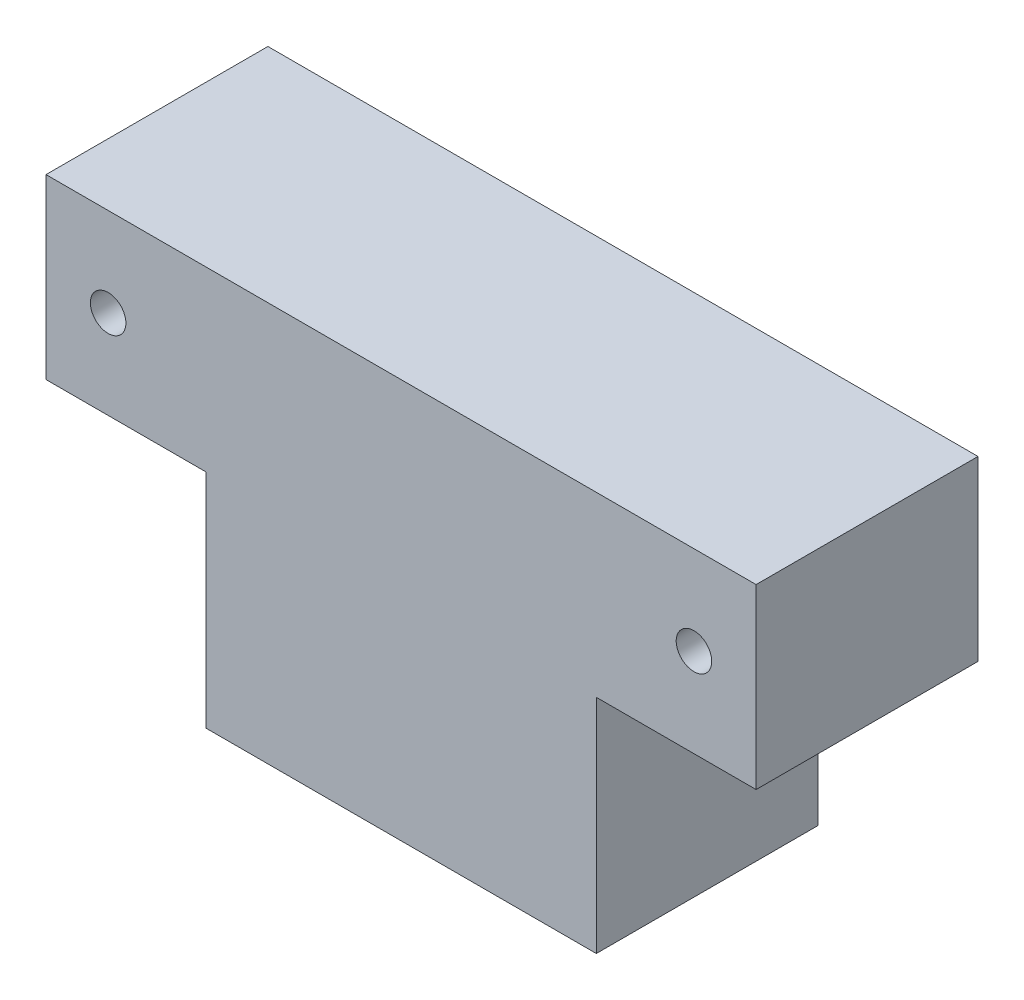
ISO-10303-21;
HEADER;
FILE_DESCRIPTION(('STEP AP214'),'2;1');
FILE_NAME('part.step','',(''),(''),'','','');
FILE_SCHEMA(('AUTOMOTIVE_DESIGN { 1 0 10303 214 1 1 1 1 }'));
ENDSEC;
DATA;
#1=APPLICATION_CONTEXT('core data for automotive mechanical design processes');
#2=APPLICATION_PROTOCOL_DEFINITION('international standard','automotive_design',2000,#1);
#3=PRODUCT_CONTEXT('',#1,'mechanical');
#4=PRODUCT('Part','Part','',(#3));
#5=PRODUCT_RELATED_PRODUCT_CATEGORY('part','',(#4));
#6=PRODUCT_DEFINITION_FORMATION('','',#4);
#7=PRODUCT_DEFINITION_CONTEXT('part definition',#1,'design');
#8=PRODUCT_DEFINITION('design','',#6,#7);
#9=PRODUCT_DEFINITION_SHAPE('','',#8);
#10=(LENGTH_UNIT() NAMED_UNIT(*) SI_UNIT(.MILLI.,.METRE.));
#11=(NAMED_UNIT(*) PLANE_ANGLE_UNIT() SI_UNIT($,.RADIAN.));
#12=(NAMED_UNIT(*) SI_UNIT($,.STERADIAN.) SOLID_ANGLE_UNIT());
#13=UNCERTAINTY_MEASURE_WITH_UNIT(LENGTH_MEASURE(1.E-05),#10,'distance_accuracy_value','');
#14=(GEOMETRIC_REPRESENTATION_CONTEXT(3) GLOBAL_UNCERTAINTY_ASSIGNED_CONTEXT((#13)) GLOBAL_UNIT_ASSIGNED_CONTEXT((#10,
#11,#12)) REPRESENTATION_CONTEXT('',''));
#15=CARTESIAN_POINT('',(0.,0.,0.));
#16=DIRECTION('',(0.,0.,1.));
#17=DIRECTION('',(1.,0.,0.));
#18=AXIS2_PLACEMENT_3D('',#15,#16,#17);
#19=CARTESIAN_POINT('',(0.,0.,25.));
#20=DIRECTION('',(0.,0.,1.));
#21=DIRECTION('',(1.,0.,0.));
#22=AXIS2_PLACEMENT_3D('',#19,#20,#21);
#23=PLANE('',#22);
#24=CARTESIAN_POINT('',(33.,0.,25.));
#25=DIRECTION('',(0.,0.,1.));
#26=DIRECTION('',(1.,0.,0.));
#27=AXIS2_PLACEMENT_3D('',#24,#25,#26);
#28=CIRCLE('',#27,2.);
#29=CARTESIAN_POINT('',(35.,0.,25.));
#30=VERTEX_POINT('',#29);
#31=EDGE_CURVE('E134',#30,#30,#28,.T.);
#32=ORIENTED_EDGE('',*,*,#31,.F.);
#33=EDGE_LOOP('',(#32));
#34=FACE_BOUND('',#33,.T.);
#35=DIRECTION('',(0.,-1.,0.));
#36=VECTOR('',#35,1.);
#37=CARTESIAN_POINT('',(-40.,-10.,25.));
#38=LINE('',#37,#36);
#39=CARTESIAN_POINT('',(-40.,9.99999999999999,25.));
#40=VERTEX_POINT('',#39);
#41=CARTESIAN_POINT('',(-40.,-10.,25.));
#42=VERTEX_POINT('',#41);
#43=EDGE_CURVE('E145',#40,#42,#38,.T.);
#44=ORIENTED_EDGE('',*,*,#43,.T.);
#45=DIRECTION('',(1.,0.,0.));
#46=VECTOR('',#45,1.);
#47=CARTESIAN_POINT('',(-22.,-10.,25.));
#48=LINE('',#47,#46);
#49=CARTESIAN_POINT('',(-22.,-10.,25.));
#50=VERTEX_POINT('',#49);
#51=EDGE_CURVE('E93',#42,#50,#48,.T.);
#52=ORIENTED_EDGE('',*,*,#51,.T.);
#53=DIRECTION('',(0.,-1.,0.));
#54=VECTOR('',#53,1.);
#55=CARTESIAN_POINT('',(-22.,-10.,25.));
#56=LINE('',#55,#54);
#57=CARTESIAN_POINT('',(-22.,-35.,25.));
#58=VERTEX_POINT('',#57);
#59=EDGE_CURVE('E160',#50,#58,#56,.T.);
#60=ORIENTED_EDGE('',*,*,#59,.T.);
#61=DIRECTION('',(1.,0.,0.));
#62=VECTOR('',#61,1.);
#63=CARTESIAN_POINT('',(-22.,-35.,25.));
#64=LINE('',#63,#62);
#65=CARTESIAN_POINT('',(22.,-35.,25.));
#66=VERTEX_POINT('',#65);
#67=EDGE_CURVE('E173',#58,#66,#64,.T.);
#68=ORIENTED_EDGE('',*,*,#67,.T.);
#69=DIRECTION('',(0.,1.,0.));
#70=VECTOR('',#69,1.);
#71=CARTESIAN_POINT('',(22.,-10.,25.));
#72=LINE('',#71,#70);
#73=CARTESIAN_POINT('',(22.,-10.,25.));
#74=VERTEX_POINT('',#73);
#75=EDGE_CURVE('E112',#66,#74,#72,.T.);
#76=ORIENTED_EDGE('',*,*,#75,.T.);
#77=DIRECTION('',(1.,0.,0.));
#78=VECTOR('',#77,1.);
#79=CARTESIAN_POINT('',(40.,-9.99999999999999,25.));
#80=LINE('',#79,#78);
#81=CARTESIAN_POINT('',(40.,-9.99999999999999,25.));
#82=VERTEX_POINT('',#81);
#83=EDGE_CURVE('E106',#74,#82,#80,.T.);
#84=ORIENTED_EDGE('',*,*,#83,.T.);
#85=DIRECTION('',(0.,1.,0.));
#86=VECTOR('',#85,1.);
#87=CARTESIAN_POINT('',(40.,-9.99999999999999,25.));
#88=LINE('',#87,#86);
#89=CARTESIAN_POINT('',(40.,10.,25.));
#90=VERTEX_POINT('',#89);
#91=EDGE_CURVE('E110',#82,#90,#88,.T.);
#92=ORIENTED_EDGE('',*,*,#91,.T.);
#93=DIRECTION('',(-1.,0.,0.));
#94=VECTOR('',#93,1.);
#95=CARTESIAN_POINT('',(40.,10.,25.));
#96=LINE('',#95,#94);
#97=EDGE_CURVE('E50',#90,#40,#96,.T.);
#98=ORIENTED_EDGE('',*,*,#97,.T.);
#99=EDGE_LOOP('',(#44,#52,#60,#68,#76,#84,#92,#98));
#100=FACE_BOUND('',#99,.T.);
#101=CARTESIAN_POINT('',(-33.,0.,25.));
#102=DIRECTION('',(0.,0.,1.));
#103=DIRECTION('',(1.,0.,0.));
#104=AXIS2_PLACEMENT_3D('',#101,#102,#103);
#105=CIRCLE('',#104,2.);
#106=CARTESIAN_POINT('',(-31.,0.,25.));
#107=VERTEX_POINT('',#106);
#108=EDGE_CURVE('E182',#107,#107,#105,.T.);
#109=ORIENTED_EDGE('',*,*,#108,.F.);
#110=EDGE_LOOP('',(#109));
#111=FACE_BOUND('',#110,.T.);
#112=ADVANCED_FACE('F33',(#34,#100,#111),#23,.T.);
#113=CARTESIAN_POINT('',(0.,0.,0.));
#114=DIRECTION('',(0.,0.,1.));
#115=DIRECTION('',(1.,0.,0.));
#116=AXIS2_PLACEMENT_3D('',#113,#114,#115);
#117=PLANE('',#116);
#118=DIRECTION('',(0.,-1.,0.));
#119=VECTOR('',#118,1.);
#120=CARTESIAN_POINT('',(-40.,-10.,0.));
#121=LINE('',#120,#119);
#122=CARTESIAN_POINT('',(-40.,9.99999999999999,0.));
#123=VERTEX_POINT('',#122);
#124=CARTESIAN_POINT('',(-40.,-10.,0.));
#125=VERTEX_POINT('',#124);
#126=EDGE_CURVE('E130',#123,#125,#121,.T.);
#127=ORIENTED_EDGE('',*,*,#126,.F.);
#128=DIRECTION('',(-1.,0.,0.));
#129=VECTOR('',#128,1.);
#130=CARTESIAN_POINT('',(40.,10.,0.));
#131=LINE('',#130,#129);
#132=CARTESIAN_POINT('',(40.,10.,0.));
#133=VERTEX_POINT('',#132);
#134=EDGE_CURVE('E85',#133,#123,#131,.T.);
#135=ORIENTED_EDGE('',*,*,#134,.F.);
#136=DIRECTION('',(0.,1.,0.));
#137=VECTOR('',#136,1.);
#138=CARTESIAN_POINT('',(40.,-9.99999999999999,0.));
#139=LINE('',#138,#137);
#140=CARTESIAN_POINT('',(40.,-9.99999999999999,0.));
#141=VERTEX_POINT('',#140);
#142=EDGE_CURVE('E79',#141,#133,#139,.T.);
#143=ORIENTED_EDGE('',*,*,#142,.F.);
#144=DIRECTION('',(1.,0.,0.));
#145=VECTOR('',#144,1.);
#146=CARTESIAN_POINT('',(40.,-9.99999999999999,0.));
#147=LINE('',#146,#145);
#148=CARTESIAN_POINT('',(22.,-10.,0.));
#149=VERTEX_POINT('',#148);
#150=EDGE_CURVE('E120',#149,#141,#147,.T.);
#151=ORIENTED_EDGE('',*,*,#150,.F.);
#152=DIRECTION('',(0.,1.,0.));
#153=VECTOR('',#152,1.);
#154=CARTESIAN_POINT('',(22.,-10.,0.));
#155=LINE('',#154,#153);
#156=CARTESIAN_POINT('',(22.,-35.,0.));
#157=VERTEX_POINT('',#156);
#158=EDGE_CURVE('E140',#157,#149,#155,.T.);
#159=ORIENTED_EDGE('',*,*,#158,.F.);
#160=DIRECTION('',(1.,0.,0.));
#161=VECTOR('',#160,1.);
#162=CARTESIAN_POINT('',(-22.,-35.,0.));
#163=LINE('',#162,#161);
#164=CARTESIAN_POINT('',(-22.,-35.,0.));
#165=VERTEX_POINT('',#164);
#166=EDGE_CURVE('E138',#165,#157,#163,.T.);
#167=ORIENTED_EDGE('',*,*,#166,.F.);
#168=DIRECTION('',(0.,-1.,0.));
#169=VECTOR('',#168,1.);
#170=CARTESIAN_POINT('',(-22.,-10.,0.));
#171=LINE('',#170,#169);
#172=CARTESIAN_POINT('',(-22.,-10.,0.));
#173=VERTEX_POINT('',#172);
#174=EDGE_CURVE('E136',#173,#165,#171,.T.);
#175=ORIENTED_EDGE('',*,*,#174,.F.);
#176=DIRECTION('',(1.,0.,0.));
#177=VECTOR('',#176,1.);
#178=CARTESIAN_POINT('',(-22.,-10.,0.));
#179=LINE('',#178,#177);
#180=EDGE_CURVE('E133',#125,#173,#179,.T.);
#181=ORIENTED_EDGE('',*,*,#180,.F.);
#182=EDGE_LOOP('',(#127,#135,#143,#151,#159,#167,#175,#181));
#183=FACE_BOUND('',#182,.T.);
#184=CARTESIAN_POINT('',(33.,0.,0.));
#185=DIRECTION('',(0.,0.,1.));
#186=DIRECTION('',(1.,0.,0.));
#187=AXIS2_PLACEMENT_3D('',#184,#185,#186);
#188=CIRCLE('',#187,2.);
#189=CARTESIAN_POINT('',(35.,0.,0.));
#190=VERTEX_POINT('',#189);
#191=EDGE_CURVE('E179',#190,#190,#188,.T.);
#192=ORIENTED_EDGE('',*,*,#191,.T.);
#193=EDGE_LOOP('',(#192));
#194=FACE_BOUND('',#193,.T.);
#195=CARTESIAN_POINT('',(-33.,0.,0.));
#196=DIRECTION('',(0.,0.,1.));
#197=DIRECTION('',(1.,0.,0.));
#198=AXIS2_PLACEMENT_3D('',#195,#196,#197);
#199=CIRCLE('',#198,2.);
#200=CARTESIAN_POINT('',(-31.,0.,0.));
#201=VERTEX_POINT('',#200);
#202=EDGE_CURVE('E185',#201,#201,#199,.T.);
#203=ORIENTED_EDGE('',*,*,#202,.T.);
#204=EDGE_LOOP('',(#203));
#205=FACE_BOUND('',#204,.T.);
#206=ADVANCED_FACE('F164',(#183,#194,#205),#117,.F.);
#207=CARTESIAN_POINT('',(-40.,-10.,25.));
#208=DIRECTION('',(1.,0.,0.));
#209=DIRECTION('',(0.,0.,-1.));
#210=AXIS2_PLACEMENT_3D('',#207,#208,#209);
#211=PLANE('',#210);
#212=ORIENTED_EDGE('',*,*,#126,.T.);
#213=DIRECTION('',(0.,0.,-1.));
#214=VECTOR('',#213,1.);
#215=CARTESIAN_POINT('',(-40.,-10.,25.));
#216=LINE('',#215,#214);
#217=EDGE_CURVE('E11',#42,#125,#216,.T.);
#218=ORIENTED_EDGE('',*,*,#217,.F.);
#219=ORIENTED_EDGE('',*,*,#43,.F.);
#220=DIRECTION('',(0.,0.,-1.));
#221=VECTOR('',#220,1.);
#222=CARTESIAN_POINT('',(-40.,9.99999999999999,25.));
#223=LINE('',#222,#221);
#224=EDGE_CURVE('E126',#40,#123,#223,.T.);
#225=ORIENTED_EDGE('',*,*,#224,.T.);
#226=EDGE_LOOP('',(#212,#218,#219,#225));
#227=FACE_BOUND('',#226,.T.);
#228=ADVANCED_FACE('F35',(#227),#211,.F.);
#229=CARTESIAN_POINT('',(-22.,-10.,25.));
#230=DIRECTION('',(0.,1.,0.));
#231=DIRECTION('',(-1.,0.,0.));
#232=AXIS2_PLACEMENT_3D('',#229,#230,#231);
#233=PLANE('',#232);
#234=ORIENTED_EDGE('',*,*,#180,.T.);
#235=DIRECTION('',(0.,0.,-1.));
#236=VECTOR('',#235,1.);
#237=CARTESIAN_POINT('',(-22.,-10.,25.));
#238=LINE('',#237,#236);
#239=EDGE_CURVE('E42',#50,#173,#238,.T.);
#240=ORIENTED_EDGE('',*,*,#239,.F.);
#241=ORIENTED_EDGE('',*,*,#51,.F.);
#242=ORIENTED_EDGE('',*,*,#217,.T.);
#243=EDGE_LOOP('',(#234,#240,#241,#242));
#244=FACE_BOUND('',#243,.T.);
#245=ADVANCED_FACE('F217',(#244),#233,.F.);
#246=CARTESIAN_POINT('',(-22.,-10.,25.));
#247=DIRECTION('',(1.,0.,0.));
#248=DIRECTION('',(0.,1.,0.));
#249=AXIS2_PLACEMENT_3D('',#246,#247,#248);
#250=PLANE('',#249);
#251=ORIENTED_EDGE('',*,*,#174,.T.);
#252=DIRECTION('',(0.,0.,-1.));
#253=VECTOR('',#252,1.);
#254=CARTESIAN_POINT('',(-22.,-35.,25.));
#255=LINE('',#254,#253);
#256=EDGE_CURVE('E152',#58,#165,#255,.T.);
#257=ORIENTED_EDGE('',*,*,#256,.F.);
#258=ORIENTED_EDGE('',*,*,#59,.F.);
#259=ORIENTED_EDGE('',*,*,#239,.T.);
#260=EDGE_LOOP('',(#251,#257,#258,#259));
#261=FACE_BOUND('',#260,.T.);
#262=ADVANCED_FACE('F158',(#261),#250,.F.);
#263=CARTESIAN_POINT('',(-22.,-35.,25.));
#264=DIRECTION('',(0.,1.,0.));
#265=DIRECTION('',(0.,0.,1.));
#266=AXIS2_PLACEMENT_3D('',#263,#264,#265);
#267=PLANE('',#266);
#268=ORIENTED_EDGE('',*,*,#166,.T.);
#269=DIRECTION('',(0.,0.,-1.));
#270=VECTOR('',#269,1.);
#271=CARTESIAN_POINT('',(22.,-35.,25.));
#272=LINE('',#271,#270);
#273=EDGE_CURVE('E149',#66,#157,#272,.T.);
#274=ORIENTED_EDGE('',*,*,#273,.F.);
#275=ORIENTED_EDGE('',*,*,#67,.F.);
#276=ORIENTED_EDGE('',*,*,#256,.T.);
#277=EDGE_LOOP('',(#268,#274,#275,#276));
#278=FACE_BOUND('',#277,.T.);
#279=ADVANCED_FACE('F169',(#278),#267,.F.);
#280=CARTESIAN_POINT('',(22.,-10.,25.));
#281=DIRECTION('',(-1.,0.,0.));
#282=DIRECTION('',(0.,-1.,0.));
#283=AXIS2_PLACEMENT_3D('',#280,#281,#282);
#284=PLANE('',#283);
#285=ORIENTED_EDGE('',*,*,#158,.T.);
#286=DIRECTION('',(0.,0.,-1.));
#287=VECTOR('',#286,1.);
#288=CARTESIAN_POINT('',(22.,-10.,25.));
#289=LINE('',#288,#287);
#290=EDGE_CURVE('E121',#74,#149,#289,.T.);
#291=ORIENTED_EDGE('',*,*,#290,.F.);
#292=ORIENTED_EDGE('',*,*,#75,.F.);
#293=ORIENTED_EDGE('',*,*,#273,.T.);
#294=EDGE_LOOP('',(#285,#291,#292,#293));
#295=FACE_BOUND('',#294,.T.);
#296=ADVANCED_FACE('F172',(#295),#284,.F.);
#297=CARTESIAN_POINT('',(40.,-9.99999999999999,25.));
#298=DIRECTION('',(0.,1.,0.));
#299=DIRECTION('',(-1.,0.,0.));
#300=AXIS2_PLACEMENT_3D('',#297,#298,#299);
#301=PLANE('',#300);
#302=ORIENTED_EDGE('',*,*,#150,.T.);
#303=DIRECTION('',(0.,0.,-1.));
#304=VECTOR('',#303,1.);
#305=CARTESIAN_POINT('',(40.,-9.99999999999999,25.));
#306=LINE('',#305,#304);
#307=EDGE_CURVE('E117',#82,#141,#306,.T.);
#308=ORIENTED_EDGE('',*,*,#307,.F.);
#309=ORIENTED_EDGE('',*,*,#83,.F.);
#310=ORIENTED_EDGE('',*,*,#290,.T.);
#311=EDGE_LOOP('',(#302,#308,#309,#310));
#312=FACE_BOUND('',#311,.T.);
#313=ADVANCED_FACE('F118',(#312),#301,.F.);
#314=CARTESIAN_POINT('',(40.,-9.99999999999999,25.));
#315=DIRECTION('',(-1.,0.,0.));
#316=DIRECTION('',(0.,0.,1.));
#317=AXIS2_PLACEMENT_3D('',#314,#315,#316);
#318=PLANE('',#317);
#319=ORIENTED_EDGE('',*,*,#142,.T.);
#320=DIRECTION('',(0.,0.,-1.));
#321=VECTOR('',#320,1.);
#322=CARTESIAN_POINT('',(40.,10.,25.));
#323=LINE('',#322,#321);
#324=EDGE_CURVE('E122',#90,#133,#323,.T.);
#325=ORIENTED_EDGE('',*,*,#324,.F.);
#326=ORIENTED_EDGE('',*,*,#91,.F.);
#327=ORIENTED_EDGE('',*,*,#307,.T.);
#328=EDGE_LOOP('',(#319,#325,#326,#327));
#329=FACE_BOUND('',#328,.T.);
#330=ADVANCED_FACE('F124',(#329),#318,.F.);
#331=CARTESIAN_POINT('',(40.,10.,25.));
#332=DIRECTION('',(0.,-1.,0.));
#333=DIRECTION('',(1.,0.,0.));
#334=AXIS2_PLACEMENT_3D('',#331,#332,#333);
#335=PLANE('',#334);
#336=ORIENTED_EDGE('',*,*,#134,.T.);
#337=ORIENTED_EDGE('',*,*,#224,.F.);
#338=ORIENTED_EDGE('',*,*,#97,.F.);
#339=ORIENTED_EDGE('',*,*,#324,.T.);
#340=EDGE_LOOP('',(#336,#337,#338,#339));
#341=FACE_BOUND('',#340,.T.);
#342=ADVANCED_FACE('F205',(#341),#335,.F.);
#343=CARTESIAN_POINT('',(33.,0.,25.));
#344=DIRECTION('',(0.,0.,-1.));
#345=DIRECTION('',(-1.,0.,0.));
#346=AXIS2_PLACEMENT_3D('',#343,#344,#345);
#347=CYLINDRICAL_SURFACE('',#346,2.);
#348=ORIENTED_EDGE('',*,*,#31,.T.);
#349=EDGE_LOOP('',(#348));
#350=FACE_BOUND('',#349,.T.);
#351=ORIENTED_EDGE('',*,*,#191,.F.);
#352=EDGE_LOOP('',(#351));
#353=FACE_BOUND('',#352,.T.);
#354=ADVANCED_FACE('F202',(#350,#353),#347,.F.);
#355=CARTESIAN_POINT('',(-33.,0.,25.));
#356=DIRECTION('',(0.,0.,-1.));
#357=DIRECTION('',(-1.,0.,0.));
#358=AXIS2_PLACEMENT_3D('',#355,#356,#357);
#359=CYLINDRICAL_SURFACE('',#358,2.);
#360=ORIENTED_EDGE('',*,*,#108,.T.);
#361=EDGE_LOOP('',(#360));
#362=FACE_BOUND('',#361,.T.);
#363=ORIENTED_EDGE('',*,*,#202,.F.);
#364=EDGE_LOOP('',(#363));
#365=FACE_BOUND('',#364,.T.);
#366=ADVANCED_FACE('F191',(#362,#365),#359,.F.);
#367=CLOSED_SHELL('',(#112,#206,#228,#245,#262,#279,#296,#313,#330,#342,#354,#366));
#368=MANIFOLD_SOLID_BREP('B2',#367);
#369=ADVANCED_BREP_SHAPE_REPRESENTATION('',(#18,#368),#14);
#370=SHAPE_DEFINITION_REPRESENTATION(#9,#369);
ENDSEC;
END-ISO-10303-21;
